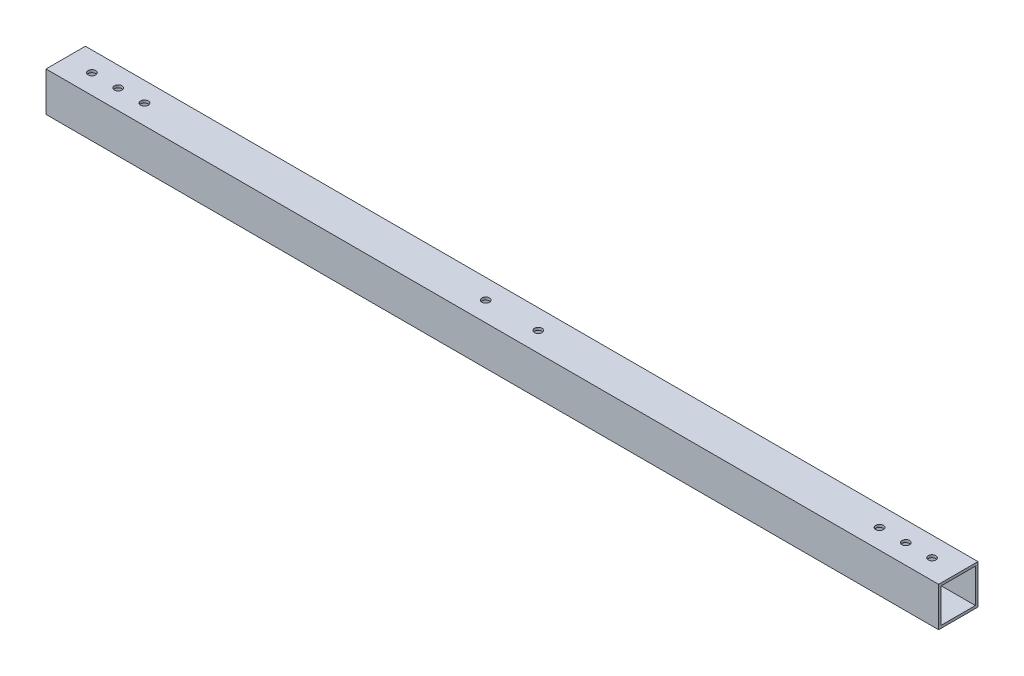
ISO-10303-21;
HEADER;
FILE_DESCRIPTION(('STEP AP214'),'2;1');
FILE_NAME('part.step','',(''),(''),'','','');
FILE_SCHEMA(('AUTOMOTIVE_DESIGN { 1 0 10303 214 1 1 1 1 }'));
ENDSEC;
DATA;
#1=APPLICATION_CONTEXT('core data for automotive mechanical design processes');
#2=APPLICATION_PROTOCOL_DEFINITION('international standard','automotive_design',2000,#1);
#3=PRODUCT_CONTEXT('',#1,'mechanical');
#4=PRODUCT('Part','Part','',(#3));
#5=PRODUCT_RELATED_PRODUCT_CATEGORY('part','',(#4));
#6=PRODUCT_DEFINITION_FORMATION('','',#4);
#7=PRODUCT_DEFINITION_CONTEXT('part definition',#1,'design');
#8=PRODUCT_DEFINITION('design','',#6,#7);
#9=PRODUCT_DEFINITION_SHAPE('','',#8);
#10=(LENGTH_UNIT() NAMED_UNIT(*) SI_UNIT(.MILLI.,.METRE.));
#11=(NAMED_UNIT(*) PLANE_ANGLE_UNIT() SI_UNIT($,.RADIAN.));
#12=(NAMED_UNIT(*) SI_UNIT($,.STERADIAN.) SOLID_ANGLE_UNIT());
#13=UNCERTAINTY_MEASURE_WITH_UNIT(LENGTH_MEASURE(1.E-05),#10,'distance_accuracy_value','');
#14=(GEOMETRIC_REPRESENTATION_CONTEXT(3) GLOBAL_UNCERTAINTY_ASSIGNED_CONTEXT((#13)) GLOBAL_UNIT_ASSIGNED_CONTEXT((#10,
#11,#12)) REPRESENTATION_CONTEXT('',''));
#15=CARTESIAN_POINT('',(0.,0.,0.));
#16=DIRECTION('',(0.,0.,1.));
#17=DIRECTION('',(1.,0.,0.));
#18=AXIS2_PLACEMENT_3D('',#15,#16,#17);
#19=CARTESIAN_POINT('',(340.,0.,0.));
#20=DIRECTION('',(1.,0.,0.));
#21=DIRECTION('',(0.,0.,-1.));
#22=AXIS2_PLACEMENT_3D('',#19,#20,#21);
#23=PLANE('',#22);
#24=DIRECTION('',(0.,1.,0.));
#25=VECTOR('',#24,1.);
#26=CARTESIAN_POINT('',(340.,7.5,-7.5));
#27=LINE('',#26,#25);
#28=CARTESIAN_POINT('',(340.,-7.5,-7.5));
#29=VERTEX_POINT('',#28);
#30=CARTESIAN_POINT('',(340.,7.5,-7.5));
#31=VERTEX_POINT('',#30);
#32=EDGE_CURVE('E146',#29,#31,#27,.T.);
#33=ORIENTED_EDGE('',*,*,#32,.T.);
#34=DIRECTION('',(0.,0.,1.));
#35=VECTOR('',#34,1.);
#36=CARTESIAN_POINT('',(340.,7.5,7.50000000000001));
#37=LINE('',#36,#35);
#38=CARTESIAN_POINT('',(340.,7.5,7.50000000000001));
#39=VERTEX_POINT('',#38);
#40=EDGE_CURVE('E149',#31,#39,#37,.T.);
#41=ORIENTED_EDGE('',*,*,#40,.T.);
#42=DIRECTION('',(0.,-1.,0.));
#43=VECTOR('',#42,1.);
#44=CARTESIAN_POINT('',(340.,7.5,7.50000000000001));
#45=LINE('',#44,#43);
#46=CARTESIAN_POINT('',(340.,-7.5,7.5));
#47=VERTEX_POINT('',#46);
#48=EDGE_CURVE('E152',#39,#47,#45,.T.);
#49=ORIENTED_EDGE('',*,*,#48,.T.);
#50=DIRECTION('',(0.,0.,-1.));
#51=VECTOR('',#50,1.);
#52=CARTESIAN_POINT('',(340.,-7.5,7.5));
#53=LINE('',#52,#51);
#54=EDGE_CURVE('E154',#47,#29,#53,.T.);
#55=ORIENTED_EDGE('',*,*,#54,.T.);
#56=EDGE_LOOP('',(#33,#41,#49,#55));
#57=FACE_BOUND('',#56,.T.);
#58=DIRECTION('',(0.,0.,1.));
#59=VECTOR('',#58,1.);
#60=CARTESIAN_POINT('',(340.,6.5,6.5));
#61=LINE('',#60,#59);
#62=CARTESIAN_POINT('',(340.,6.5,-6.5));
#63=VERTEX_POINT('',#62);
#64=CARTESIAN_POINT('',(340.,6.5,6.5));
#65=VERTEX_POINT('',#64);
#66=EDGE_CURVE('E116',#63,#65,#61,.T.);
#67=ORIENTED_EDGE('',*,*,#66,.F.);
#68=DIRECTION('',(0.,1.,0.));
#69=VECTOR('',#68,1.);
#70=CARTESIAN_POINT('',(340.,6.5,-6.5));
#71=LINE('',#70,#69);
#72=CARTESIAN_POINT('',(340.,-6.5,-6.5));
#73=VERTEX_POINT('',#72);
#74=EDGE_CURVE('E108',#73,#63,#71,.T.);
#75=ORIENTED_EDGE('',*,*,#74,.F.);
#76=DIRECTION('',(0.,0.,-1.));
#77=VECTOR('',#76,1.);
#78=CARTESIAN_POINT('',(340.,-6.5,6.5));
#79=LINE('',#78,#77);
#80=CARTESIAN_POINT('',(340.,-6.5,6.5));
#81=VERTEX_POINT('',#80);
#82=EDGE_CURVE('E130',#81,#73,#79,.T.);
#83=ORIENTED_EDGE('',*,*,#82,.F.);
#84=DIRECTION('',(0.,-1.,0.));
#85=VECTOR('',#84,1.);
#86=CARTESIAN_POINT('',(340.,6.5,6.5));
#87=LINE('',#86,#85);
#88=EDGE_CURVE('E128',#65,#81,#87,.T.);
#89=ORIENTED_EDGE('',*,*,#88,.F.);
#90=EDGE_LOOP('',(#67,#75,#83,#89));
#91=FACE_BOUND('',#90,.T.);
#92=ADVANCED_FACE('F41',(#57,#91),#23,.T.);
#93=CARTESIAN_POINT('',(0.,0.,0.));
#94=DIRECTION('',(1.,0.,0.));
#95=DIRECTION('',(0.,0.,-1.));
#96=AXIS2_PLACEMENT_3D('',#93,#94,#95);
#97=PLANE('',#96);
#98=DIRECTION('',(0.,1.,0.));
#99=VECTOR('',#98,1.);
#100=CARTESIAN_POINT('',(0.,7.5,-7.5));
#101=LINE('',#100,#99);
#102=CARTESIAN_POINT('',(0.,-7.5,-7.5));
#103=VERTEX_POINT('',#102);
#104=CARTESIAN_POINT('',(0.,7.5,-7.5));
#105=VERTEX_POINT('',#104);
#106=EDGE_CURVE('E124',#103,#105,#101,.T.);
#107=ORIENTED_EDGE('',*,*,#106,.F.);
#108=DIRECTION('',(0.,0.,-1.));
#109=VECTOR('',#108,1.);
#110=CARTESIAN_POINT('',(0.,-7.5,7.5));
#111=LINE('',#110,#109);
#112=CARTESIAN_POINT('',(0.,-7.5,7.5));
#113=VERTEX_POINT('',#112);
#114=EDGE_CURVE('E150',#113,#103,#111,.T.);
#115=ORIENTED_EDGE('',*,*,#114,.F.);
#116=DIRECTION('',(0.,-1.,0.));
#117=VECTOR('',#116,1.);
#118=CARTESIAN_POINT('',(0.,7.5,7.50000000000001));
#119=LINE('',#118,#117);
#120=CARTESIAN_POINT('',(0.,7.5,7.50000000000001));
#121=VERTEX_POINT('',#120);
#122=EDGE_CURVE('E161',#121,#113,#119,.T.);
#123=ORIENTED_EDGE('',*,*,#122,.F.);
#124=DIRECTION('',(0.,0.,1.));
#125=VECTOR('',#124,1.);
#126=CARTESIAN_POINT('',(0.,7.5,7.50000000000001));
#127=LINE('',#126,#125);
#128=EDGE_CURVE('E159',#105,#121,#127,.T.);
#129=ORIENTED_EDGE('',*,*,#128,.F.);
#130=EDGE_LOOP('',(#107,#115,#123,#129));
#131=FACE_BOUND('',#130,.T.);
#132=DIRECTION('',(0.,1.,0.));
#133=VECTOR('',#132,1.);
#134=CARTESIAN_POINT('',(0.,6.5,-6.5));
#135=LINE('',#134,#133);
#136=CARTESIAN_POINT('',(0.,-6.5,-6.5));
#137=VERTEX_POINT('',#136);
#138=CARTESIAN_POINT('',(0.,6.5,-6.5));
#139=VERTEX_POINT('',#138);
#140=EDGE_CURVE('E66',#137,#139,#135,.T.);
#141=ORIENTED_EDGE('',*,*,#140,.T.);
#142=DIRECTION('',(0.,0.,1.));
#143=VECTOR('',#142,1.);
#144=CARTESIAN_POINT('',(0.,6.5,6.5));
#145=LINE('',#144,#143);
#146=CARTESIAN_POINT('',(0.,6.5,6.5));
#147=VERTEX_POINT('',#146);
#148=EDGE_CURVE('E123',#139,#147,#145,.T.);
#149=ORIENTED_EDGE('',*,*,#148,.T.);
#150=DIRECTION('',(0.,-1.,0.));
#151=VECTOR('',#150,1.);
#152=CARTESIAN_POINT('',(0.,6.5,6.5));
#153=LINE('',#152,#151);
#154=CARTESIAN_POINT('',(0.,-6.5,6.5));
#155=VERTEX_POINT('',#154);
#156=EDGE_CURVE('E138',#147,#155,#153,.T.);
#157=ORIENTED_EDGE('',*,*,#156,.T.);
#158=DIRECTION('',(0.,0.,-1.));
#159=VECTOR('',#158,1.);
#160=CARTESIAN_POINT('',(0.,-6.5,6.5));
#161=LINE('',#160,#159);
#162=EDGE_CURVE('E117',#155,#137,#161,.T.);
#163=ORIENTED_EDGE('',*,*,#162,.T.);
#164=EDGE_LOOP('',(#141,#149,#157,#163));
#165=FACE_BOUND('',#164,.T.);
#166=ADVANCED_FACE('F259',(#131,#165),#97,.F.);
#167=CARTESIAN_POINT('',(340.,7.5,-7.5));
#168=DIRECTION('',(0.,0.,1.));
#169=DIRECTION('',(0.,-1.,0.));
#170=AXIS2_PLACEMENT_3D('',#167,#168,#169);
#171=PLANE('',#170);
#172=ORIENTED_EDGE('',*,*,#106,.T.);
#173=DIRECTION('',(-1.,0.,0.));
#174=VECTOR('',#173,1.);
#175=CARTESIAN_POINT('',(340.,7.5,-7.5));
#176=LINE('',#175,#174);
#177=EDGE_CURVE('E11',#31,#105,#176,.T.);
#178=ORIENTED_EDGE('',*,*,#177,.F.);
#179=ORIENTED_EDGE('',*,*,#32,.F.);
#180=DIRECTION('',(-1.,0.,0.));
#181=VECTOR('',#180,1.);
#182=CARTESIAN_POINT('',(340.,-7.5,-7.5));
#183=LINE('',#182,#181);
#184=EDGE_CURVE('E156',#29,#103,#183,.T.);
#185=ORIENTED_EDGE('',*,*,#184,.T.);
#186=EDGE_LOOP('',(#172,#178,#179,#185));
#187=FACE_BOUND('',#186,.T.);
#188=ADVANCED_FACE('F43',(#187),#171,.F.);
#189=CARTESIAN_POINT('',(340.,7.5,7.50000000000001));
#190=DIRECTION('',(0.,-1.,0.));
#191=DIRECTION('',(0.,0.,-1.));
#192=AXIS2_PLACEMENT_3D('',#189,#190,#191);
#193=PLANE('',#192);
#194=CARTESIAN_POINT('',(9.99999999999965,7.5,0.));
#195=DIRECTION('',(0.,1.,0.));
#196=DIRECTION('',(0.,0.,1.));
#197=AXIS2_PLACEMENT_3D('',#194,#195,#196);
#198=CIRCLE('',#197,1.45);
#199=CARTESIAN_POINT('',(9.99999999999965,7.5,1.44999999999995));
#200=VERTEX_POINT('',#199);
#201=EDGE_CURVE('E493',#200,#200,#198,.T.);
#202=ORIENTED_EDGE('',*,*,#201,.F.);
#203=EDGE_LOOP('',(#202));
#204=FACE_BOUND('',#203,.T.);
#205=CARTESIAN_POINT('',(320.,7.5,0.));
#206=DIRECTION('',(0.,1.,0.));
#207=DIRECTION('',(0.,0.,-1.));
#208=AXIS2_PLACEMENT_3D('',#205,#206,#207);
#209=CIRCLE('',#208,1.45);
#210=CARTESIAN_POINT('',(320.,7.5,-1.45000000000005));
#211=VERTEX_POINT('',#210);
#212=EDGE_CURVE('E502',#211,#211,#209,.T.);
#213=ORIENTED_EDGE('',*,*,#212,.F.);
#214=EDGE_LOOP('',(#213));
#215=FACE_BOUND('',#214,.T.);
#216=CARTESIAN_POINT('',(310.,7.5,0.));
#217=DIRECTION('',(0.,1.,0.));
#218=DIRECTION('',(0.,0.,1.));
#219=AXIS2_PLACEMENT_3D('',#216,#217,#218);
#220=CIRCLE('',#219,1.45);
#221=CARTESIAN_POINT('',(310.,7.5,1.44999999999995));
#222=VERTEX_POINT('',#221);
#223=EDGE_CURVE('E512',#222,#222,#220,.T.);
#224=ORIENTED_EDGE('',*,*,#223,.F.);
#225=EDGE_LOOP('',(#224));
#226=FACE_BOUND('',#225,.T.);
#227=CARTESIAN_POINT('',(330.,7.5,0.));
#228=DIRECTION('',(0.,1.,0.));
#229=DIRECTION('',(0.,0.,-1.));
#230=AXIS2_PLACEMENT_3D('',#227,#228,#229);
#231=CIRCLE('',#230,1.44999999999995);
#232=CARTESIAN_POINT('',(330.,7.5,-1.44999999999999));
#233=VERTEX_POINT('',#232);
#234=EDGE_CURVE('E494',#233,#233,#231,.T.);
#235=ORIENTED_EDGE('',*,*,#234,.F.);
#236=EDGE_LOOP('',(#235));
#237=FACE_BOUND('',#236,.T.);
#238=CARTESIAN_POINT('',(29.9999999999997,7.5,0.));
#239=DIRECTION('',(0.,1.,0.));
#240=DIRECTION('',(0.,0.,-1.));
#241=AXIS2_PLACEMENT_3D('',#238,#239,#240);
#242=CIRCLE('',#241,1.45);
#243=CARTESIAN_POINT('',(29.9999999999997,7.5,-1.45000000000005));
#244=VERTEX_POINT('',#243);
#245=EDGE_CURVE('E517',#244,#244,#242,.T.);
#246=ORIENTED_EDGE('',*,*,#245,.F.);
#247=EDGE_LOOP('',(#246));
#248=FACE_BOUND('',#247,.T.);
#249=CARTESIAN_POINT('',(19.9999999999996,7.5,0.));
#250=DIRECTION('',(0.,1.,0.));
#251=DIRECTION('',(0.,0.,1.));
#252=AXIS2_PLACEMENT_3D('',#249,#250,#251);
#253=CIRCLE('',#252,1.45);
#254=CARTESIAN_POINT('',(19.9999999999996,7.5,1.44999999999995));
#255=VERTEX_POINT('',#254);
#256=EDGE_CURVE('E508',#255,#255,#253,.T.);
#257=ORIENTED_EDGE('',*,*,#256,.F.);
#258=EDGE_LOOP('',(#257));
#259=FACE_BOUND('',#258,.T.);
#260=CARTESIAN_POINT('',(160.,7.5,0.));
#261=DIRECTION('',(0.,-1.,0.));
#262=DIRECTION('',(0.,0.,-1.));
#263=AXIS2_PLACEMENT_3D('',#260,#261,#262);
#264=CIRCLE('',#263,1.45);
#265=CARTESIAN_POINT('',(160.,7.5,-1.45));
#266=VERTEX_POINT('',#265);
#267=EDGE_CURVE('E175',#266,#266,#264,.T.);
#268=ORIENTED_EDGE('',*,*,#267,.T.);
#269=EDGE_LOOP('',(#268));
#270=FACE_BOUND('',#269,.T.);
#271=CARTESIAN_POINT('',(180.,7.5,0.));
#272=DIRECTION('',(0.,-1.,0.));
#273=DIRECTION('',(0.,0.,1.));
#274=AXIS2_PLACEMENT_3D('',#271,#272,#273);
#275=CIRCLE('',#274,1.45);
#276=CARTESIAN_POINT('',(180.,7.5,1.45));
#277=VERTEX_POINT('',#276);
#278=EDGE_CURVE('E212',#277,#277,#275,.T.);
#279=ORIENTED_EDGE('',*,*,#278,.T.);
#280=EDGE_LOOP('',(#279));
#281=FACE_BOUND('',#280,.T.);
#282=ORIENTED_EDGE('',*,*,#128,.T.);
#283=DIRECTION('',(-1.,0.,0.));
#284=VECTOR('',#283,1.);
#285=CARTESIAN_POINT('',(340.,7.5,7.50000000000001));
#286=LINE('',#285,#284);
#287=EDGE_CURVE('E50',#39,#121,#286,.T.);
#288=ORIENTED_EDGE('',*,*,#287,.F.);
#289=ORIENTED_EDGE('',*,*,#40,.F.);
#290=ORIENTED_EDGE('',*,*,#177,.T.);
#291=EDGE_LOOP('',(#282,#288,#289,#290));
#292=FACE_BOUND('',#291,.T.);
#293=ADVANCED_FACE('F245',(#204,#215,#226,#237,#248,#259,#270,#281,#292),#193,.F.);
#294=CARTESIAN_POINT('',(340.,7.5,7.50000000000001));
#295=DIRECTION('',(0.,0.,-1.));
#296=DIRECTION('',(0.,1.,0.));
#297=AXIS2_PLACEMENT_3D('',#294,#295,#296);
#298=PLANE('',#297);
#299=ORIENTED_EDGE('',*,*,#122,.T.);
#300=DIRECTION('',(-1.,0.,0.));
#301=VECTOR('',#300,1.);
#302=CARTESIAN_POINT('',(340.,-7.5,7.5));
#303=LINE('',#302,#301);
#304=EDGE_CURVE('E166',#47,#113,#303,.T.);
#305=ORIENTED_EDGE('',*,*,#304,.F.);
#306=ORIENTED_EDGE('',*,*,#48,.F.);
#307=ORIENTED_EDGE('',*,*,#287,.T.);
#308=EDGE_LOOP('',(#299,#305,#306,#307));
#309=FACE_BOUND('',#308,.T.);
#310=ADVANCED_FACE('F248',(#309),#298,.F.);
#311=CARTESIAN_POINT('',(340.,-7.5,7.5));
#312=DIRECTION('',(0.,1.,0.));
#313=DIRECTION('',(0.,0.,1.));
#314=AXIS2_PLACEMENT_3D('',#311,#312,#313);
#315=PLANE('',#314);
#316=CARTESIAN_POINT('',(9.99999999999965,-7.5,0.));
#317=DIRECTION('',(0.,1.,0.));
#318=DIRECTION('',(0.,0.,1.));
#319=AXIS2_PLACEMENT_3D('',#316,#317,#318);
#320=CIRCLE('',#319,1.45);
#321=CARTESIAN_POINT('',(9.99999999999965,-7.5,1.44999999999995));
#322=VERTEX_POINT('',#321);
#323=EDGE_CURVE('E183',#322,#322,#320,.T.);
#324=ORIENTED_EDGE('',*,*,#323,.T.);
#325=EDGE_LOOP('',(#324));
#326=FACE_BOUND('',#325,.T.);
#327=CARTESIAN_POINT('',(320.,-7.5,0.));
#328=DIRECTION('',(0.,1.,0.));
#329=DIRECTION('',(0.,0.,-1.));
#330=AXIS2_PLACEMENT_3D('',#327,#328,#329);
#331=CIRCLE('',#330,1.45);
#332=CARTESIAN_POINT('',(320.,-7.5,-1.45000000000005));
#333=VERTEX_POINT('',#332);
#334=EDGE_CURVE('E506',#333,#333,#331,.T.);
#335=ORIENTED_EDGE('',*,*,#334,.T.);
#336=EDGE_LOOP('',(#335));
#337=FACE_BOUND('',#336,.T.);
#338=CARTESIAN_POINT('',(310.,-7.5,0.));
#339=DIRECTION('',(0.,1.,0.));
#340=DIRECTION('',(0.,0.,1.));
#341=AXIS2_PLACEMENT_3D('',#338,#339,#340);
#342=CIRCLE('',#341,1.45);
#343=CARTESIAN_POINT('',(310.,-7.5,1.44999999999995));
#344=VERTEX_POINT('',#343);
#345=EDGE_CURVE('E505',#344,#344,#342,.T.);
#346=ORIENTED_EDGE('',*,*,#345,.T.);
#347=EDGE_LOOP('',(#346));
#348=FACE_BOUND('',#347,.T.);
#349=CARTESIAN_POINT('',(330.,-7.5,0.));
#350=DIRECTION('',(0.,1.,0.));
#351=DIRECTION('',(0.,0.,-1.));
#352=AXIS2_PLACEMENT_3D('',#349,#350,#351);
#353=CIRCLE('',#352,1.44999999999995);
#354=CARTESIAN_POINT('',(330.,-7.5,-1.44999999999999));
#355=VERTEX_POINT('',#354);
#356=EDGE_CURVE('E499',#355,#355,#353,.T.);
#357=ORIENTED_EDGE('',*,*,#356,.T.);
#358=EDGE_LOOP('',(#357));
#359=FACE_BOUND('',#358,.T.);
#360=CARTESIAN_POINT('',(29.9999999999997,-7.5,0.));
#361=DIRECTION('',(0.,1.,0.));
#362=DIRECTION('',(0.,0.,-1.));
#363=AXIS2_PLACEMENT_3D('',#360,#361,#362);
#364=CIRCLE('',#363,1.45);
#365=CARTESIAN_POINT('',(29.9999999999997,-7.5,-1.45000000000005));
#366=VERTEX_POINT('',#365);
#367=EDGE_CURVE('E521',#366,#366,#364,.T.);
#368=ORIENTED_EDGE('',*,*,#367,.T.);
#369=EDGE_LOOP('',(#368));
#370=FACE_BOUND('',#369,.T.);
#371=CARTESIAN_POINT('',(19.9999999999996,-7.5,0.));
#372=DIRECTION('',(0.,1.,0.));
#373=DIRECTION('',(0.,0.,1.));
#374=AXIS2_PLACEMENT_3D('',#371,#372,#373);
#375=CIRCLE('',#374,1.45);
#376=CARTESIAN_POINT('',(19.9999999999996,-7.5,1.44999999999995));
#377=VERTEX_POINT('',#376);
#378=EDGE_CURVE('E520',#377,#377,#375,.T.);
#379=ORIENTED_EDGE('',*,*,#378,.T.);
#380=EDGE_LOOP('',(#379));
#381=FACE_BOUND('',#380,.T.);
#382=CARTESIAN_POINT('',(160.,-7.5,0.));
#383=DIRECTION('',(0.,-1.,0.));
#384=DIRECTION('',(0.,0.,-1.));
#385=AXIS2_PLACEMENT_3D('',#382,#383,#384);
#386=CIRCLE('',#385,1.45);
#387=CARTESIAN_POINT('',(160.,-7.5,-1.45));
#388=VERTEX_POINT('',#387);
#389=EDGE_CURVE('E215',#388,#388,#386,.T.);
#390=ORIENTED_EDGE('',*,*,#389,.F.);
#391=EDGE_LOOP('',(#390));
#392=FACE_BOUND('',#391,.T.);
#393=CARTESIAN_POINT('',(180.,-7.5,0.));
#394=DIRECTION('',(0.,-1.,0.));
#395=DIRECTION('',(0.,0.,1.));
#396=AXIS2_PLACEMENT_3D('',#393,#394,#395);
#397=CIRCLE('',#396,1.45);
#398=CARTESIAN_POINT('',(180.,-7.5,1.45));
#399=VERTEX_POINT('',#398);
#400=EDGE_CURVE('E218',#399,#399,#397,.T.);
#401=ORIENTED_EDGE('',*,*,#400,.F.);
#402=EDGE_LOOP('',(#401));
#403=FACE_BOUND('',#402,.T.);
#404=ORIENTED_EDGE('',*,*,#114,.T.);
#405=ORIENTED_EDGE('',*,*,#184,.F.);
#406=ORIENTED_EDGE('',*,*,#54,.F.);
#407=ORIENTED_EDGE('',*,*,#304,.T.);
#408=EDGE_LOOP('',(#404,#405,#406,#407));
#409=FACE_BOUND('',#408,.T.);
#410=ADVANCED_FACE('F263',(#326,#337,#348,#359,#370,#381,#392,#403,#409),#315,.F.);
#411=CARTESIAN_POINT('',(340.,6.5,-6.5));
#412=DIRECTION('',(0.,0.,1.));
#413=DIRECTION('',(0.,-1.,0.));
#414=AXIS2_PLACEMENT_3D('',#411,#412,#413);
#415=PLANE('',#414);
#416=ORIENTED_EDGE('',*,*,#140,.F.);
#417=DIRECTION('',(-1.,0.,0.));
#418=VECTOR('',#417,1.);
#419=CARTESIAN_POINT('',(340.,-6.5,-6.5));
#420=LINE('',#419,#418);
#421=EDGE_CURVE('E112',#73,#137,#420,.T.);
#422=ORIENTED_EDGE('',*,*,#421,.F.);
#423=ORIENTED_EDGE('',*,*,#74,.T.);
#424=DIRECTION('',(-1.,0.,0.));
#425=VECTOR('',#424,1.);
#426=CARTESIAN_POINT('',(340.,6.5,-6.5));
#427=LINE('',#426,#425);
#428=EDGE_CURVE('E111',#63,#139,#427,.T.);
#429=ORIENTED_EDGE('',*,*,#428,.T.);
#430=EDGE_LOOP('',(#416,#422,#423,#429));
#431=FACE_BOUND('',#430,.T.);
#432=ADVANCED_FACE('F110',(#431),#415,.T.);
#433=CARTESIAN_POINT('',(340.,6.5,6.5));
#434=DIRECTION('',(0.,-1.,0.));
#435=DIRECTION('',(0.,0.,-1.));
#436=AXIS2_PLACEMENT_3D('',#433,#434,#435);
#437=PLANE('',#436);
#438=CARTESIAN_POINT('',(9.99999999999965,6.5,0.));
#439=DIRECTION('',(0.,-1.,0.));
#440=DIRECTION('',(0.,0.,-1.));
#441=AXIS2_PLACEMENT_3D('',#438,#439,#440);
#442=CIRCLE('',#441,1.45);
#443=CARTESIAN_POINT('',(9.99999999999965,6.5,-1.45000000000005));
#444=VERTEX_POINT('',#443);
#445=EDGE_CURVE('E209',#444,#444,#442,.T.);
#446=ORIENTED_EDGE('',*,*,#445,.F.);
#447=EDGE_LOOP('',(#446));
#448=FACE_BOUND('',#447,.T.);
#449=CARTESIAN_POINT('',(320.,6.5,0.));
#450=DIRECTION('',(0.,-1.,0.));
#451=DIRECTION('',(0.,0.,-1.));
#452=AXIS2_PLACEMENT_3D('',#449,#450,#451);
#453=CIRCLE('',#452,1.45);
#454=CARTESIAN_POINT('',(320.,6.5,-1.45000000000005));
#455=VERTEX_POINT('',#454);
#456=EDGE_CURVE('E197',#455,#455,#453,.T.);
#457=ORIENTED_EDGE('',*,*,#456,.F.);
#458=EDGE_LOOP('',(#457));
#459=FACE_BOUND('',#458,.T.);
#460=CARTESIAN_POINT('',(310.,6.5,0.));
#461=DIRECTION('',(0.,-1.,0.));
#462=DIRECTION('',(0.,0.,-1.));
#463=AXIS2_PLACEMENT_3D('',#460,#461,#462);
#464=CIRCLE('',#463,1.45);
#465=CARTESIAN_POINT('',(310.,6.5,-1.45000000000005));
#466=VERTEX_POINT('',#465);
#467=EDGE_CURVE('E194',#466,#466,#464,.T.);
#468=ORIENTED_EDGE('',*,*,#467,.F.);
#469=EDGE_LOOP('',(#468));
#470=FACE_BOUND('',#469,.T.);
#471=CARTESIAN_POINT('',(330.,6.5,0.));
#472=DIRECTION('',(0.,-1.,0.));
#473=DIRECTION('',(0.,0.,-1.));
#474=AXIS2_PLACEMENT_3D('',#471,#472,#473);
#475=CIRCLE('',#474,1.44999999999995);
#476=CARTESIAN_POINT('',(330.,6.5,-1.44999999999999));
#477=VERTEX_POINT('',#476);
#478=EDGE_CURVE('E191',#477,#477,#475,.T.);
#479=ORIENTED_EDGE('',*,*,#478,.F.);
#480=EDGE_LOOP('',(#479));
#481=FACE_BOUND('',#480,.T.);
#482=CARTESIAN_POINT('',(29.9999999999997,6.5,0.));
#483=DIRECTION('',(0.,-1.,0.));
#484=DIRECTION('',(0.,0.,-1.));
#485=AXIS2_PLACEMENT_3D('',#482,#483,#484);
#486=CIRCLE('',#485,1.45);
#487=CARTESIAN_POINT('',(29.9999999999997,6.5,-1.45000000000005));
#488=VERTEX_POINT('',#487);
#489=EDGE_CURVE('E187',#488,#488,#486,.T.);
#490=ORIENTED_EDGE('',*,*,#489,.F.);
#491=EDGE_LOOP('',(#490));
#492=FACE_BOUND('',#491,.T.);
#493=CARTESIAN_POINT('',(19.9999999999996,6.5,0.));
#494=DIRECTION('',(0.,-1.,0.));
#495=DIRECTION('',(0.,0.,-1.));
#496=AXIS2_PLACEMENT_3D('',#493,#494,#495);
#497=CIRCLE('',#496,1.45);
#498=CARTESIAN_POINT('',(19.9999999999996,6.5,-1.45000000000005));
#499=VERTEX_POINT('',#498);
#500=EDGE_CURVE('E182',#499,#499,#497,.T.);
#501=ORIENTED_EDGE('',*,*,#500,.F.);
#502=EDGE_LOOP('',(#501));
#503=FACE_BOUND('',#502,.T.);
#504=CARTESIAN_POINT('',(160.,6.5,0.));
#505=DIRECTION('',(0.,-1.,0.));
#506=DIRECTION('',(0.,0.,-1.));
#507=AXIS2_PLACEMENT_3D('',#504,#505,#506);
#508=CIRCLE('',#507,1.45);
#509=CARTESIAN_POINT('',(160.,6.5,-1.45));
#510=VERTEX_POINT('',#509);
#511=EDGE_CURVE('E136',#510,#510,#508,.T.);
#512=ORIENTED_EDGE('',*,*,#511,.F.);
#513=EDGE_LOOP('',(#512));
#514=FACE_BOUND('',#513,.T.);
#515=CARTESIAN_POINT('',(180.,6.5,0.));
#516=DIRECTION('',(0.,-1.,0.));
#517=DIRECTION('',(0.,0.,-1.));
#518=AXIS2_PLACEMENT_3D('',#515,#516,#517);
#519=CIRCLE('',#518,1.45);
#520=CARTESIAN_POINT('',(180.,6.5,-1.45));
#521=VERTEX_POINT('',#520);
#522=EDGE_CURVE('E174',#521,#521,#519,.T.);
#523=ORIENTED_EDGE('',*,*,#522,.F.);
#524=EDGE_LOOP('',(#523));
#525=FACE_BOUND('',#524,.T.);
#526=ORIENTED_EDGE('',*,*,#148,.F.);
#527=ORIENTED_EDGE('',*,*,#428,.F.);
#528=ORIENTED_EDGE('',*,*,#66,.T.);
#529=DIRECTION('',(-1.,0.,0.));
#530=VECTOR('',#529,1.);
#531=CARTESIAN_POINT('',(340.,6.5,6.5));
#532=LINE('',#531,#530);
#533=EDGE_CURVE('E125',#65,#147,#532,.T.);
#534=ORIENTED_EDGE('',*,*,#533,.T.);
#535=EDGE_LOOP('',(#526,#527,#528,#534));
#536=FACE_BOUND('',#535,.T.);
#537=ADVANCED_FACE('F120',(#448,#459,#470,#481,#492,#503,#514,#525,#536),#437,.T.);
#538=CARTESIAN_POINT('',(340.,6.5,6.5));
#539=DIRECTION('',(0.,0.,-1.));
#540=DIRECTION('',(0.,1.,0.));
#541=AXIS2_PLACEMENT_3D('',#538,#539,#540);
#542=PLANE('',#541);
#543=ORIENTED_EDGE('',*,*,#156,.F.);
#544=ORIENTED_EDGE('',*,*,#533,.F.);
#545=ORIENTED_EDGE('',*,*,#88,.T.);
#546=DIRECTION('',(-1.,0.,0.));
#547=VECTOR('',#546,1.);
#548=CARTESIAN_POINT('',(340.,-6.5,6.5));
#549=LINE('',#548,#547);
#550=EDGE_CURVE('E58',#81,#155,#549,.T.);
#551=ORIENTED_EDGE('',*,*,#550,.T.);
#552=EDGE_LOOP('',(#543,#544,#545,#551));
#553=FACE_BOUND('',#552,.T.);
#554=ADVANCED_FACE('F232',(#553),#542,.T.);
#555=CARTESIAN_POINT('',(340.,-6.5,6.5));
#556=DIRECTION('',(0.,1.,0.));
#557=DIRECTION('',(0.,0.,1.));
#558=AXIS2_PLACEMENT_3D('',#555,#556,#557);
#559=PLANE('',#558);
#560=CARTESIAN_POINT('',(9.99999999999965,-6.5,0.));
#561=DIRECTION('',(0.,1.,0.));
#562=DIRECTION('',(0.,0.,1.));
#563=AXIS2_PLACEMENT_3D('',#560,#561,#562);
#564=CIRCLE('',#563,1.45);
#565=CARTESIAN_POINT('',(9.99999999999965,-6.5,1.44999999999995));
#566=VERTEX_POINT('',#565);
#567=EDGE_CURVE('E45',#566,#566,#564,.T.);
#568=ORIENTED_EDGE('',*,*,#567,.F.);
#569=EDGE_LOOP('',(#568));
#570=FACE_BOUND('',#569,.T.);
#571=CARTESIAN_POINT('',(320.,-6.5,0.));
#572=DIRECTION('',(0.,1.,0.));
#573=DIRECTION('',(0.,0.,1.));
#574=AXIS2_PLACEMENT_3D('',#571,#572,#573);
#575=CIRCLE('',#574,1.45);
#576=CARTESIAN_POINT('',(320.,-6.5,1.44999999999995));
#577=VERTEX_POINT('',#576);
#578=EDGE_CURVE('E195',#577,#577,#575,.T.);
#579=ORIENTED_EDGE('',*,*,#578,.F.);
#580=EDGE_LOOP('',(#579));
#581=FACE_BOUND('',#580,.T.);
#582=CARTESIAN_POINT('',(310.,-6.5,0.));
#583=DIRECTION('',(0.,1.,0.));
#584=DIRECTION('',(0.,0.,1.));
#585=AXIS2_PLACEMENT_3D('',#582,#583,#584);
#586=CIRCLE('',#585,1.45);
#587=CARTESIAN_POINT('',(310.,-6.5,1.44999999999995));
#588=VERTEX_POINT('',#587);
#589=EDGE_CURVE('E192',#588,#588,#586,.T.);
#590=ORIENTED_EDGE('',*,*,#589,.F.);
#591=EDGE_LOOP('',(#590));
#592=FACE_BOUND('',#591,.T.);
#593=CARTESIAN_POINT('',(330.,-6.5,0.));
#594=DIRECTION('',(0.,1.,0.));
#595=DIRECTION('',(0.,0.,1.));
#596=AXIS2_PLACEMENT_3D('',#593,#594,#595);
#597=CIRCLE('',#596,1.44999999999995);
#598=CARTESIAN_POINT('',(330.,-6.5,1.4499999999999));
#599=VERTEX_POINT('',#598);
#600=EDGE_CURVE('E188',#599,#599,#597,.T.);
#601=ORIENTED_EDGE('',*,*,#600,.F.);
#602=EDGE_LOOP('',(#601));
#603=FACE_BOUND('',#602,.T.);
#604=CARTESIAN_POINT('',(29.9999999999997,-6.5,0.));
#605=DIRECTION('',(0.,1.,0.));
#606=DIRECTION('',(0.,0.,1.));
#607=AXIS2_PLACEMENT_3D('',#604,#605,#606);
#608=CIRCLE('',#607,1.45);
#609=CARTESIAN_POINT('',(29.9999999999997,-6.5,1.44999999999995));
#610=VERTEX_POINT('',#609);
#611=EDGE_CURVE('E184',#610,#610,#608,.T.);
#612=ORIENTED_EDGE('',*,*,#611,.F.);
#613=EDGE_LOOP('',(#612));
#614=FACE_BOUND('',#613,.T.);
#615=CARTESIAN_POINT('',(19.9999999999996,-6.5,0.));
#616=DIRECTION('',(0.,1.,0.));
#617=DIRECTION('',(0.,0.,1.));
#618=AXIS2_PLACEMENT_3D('',#615,#616,#617);
#619=CIRCLE('',#618,1.45);
#620=CARTESIAN_POINT('',(19.9999999999996,-6.5,1.44999999999995));
#621=VERTEX_POINT('',#620);
#622=EDGE_CURVE('E179',#621,#621,#619,.T.);
#623=ORIENTED_EDGE('',*,*,#622,.F.);
#624=EDGE_LOOP('',(#623));
#625=FACE_BOUND('',#624,.T.);
#626=CARTESIAN_POINT('',(160.,-6.5,0.));
#627=DIRECTION('',(0.,1.,0.));
#628=DIRECTION('',(0.,0.,1.));
#629=AXIS2_PLACEMENT_3D('',#626,#627,#628);
#630=CIRCLE('',#629,1.45);
#631=CARTESIAN_POINT('',(160.,-6.5,1.45));
#632=VERTEX_POINT('',#631);
#633=EDGE_CURVE('E176',#632,#632,#630,.T.);
#634=ORIENTED_EDGE('',*,*,#633,.F.);
#635=EDGE_LOOP('',(#634));
#636=FACE_BOUND('',#635,.T.);
#637=CARTESIAN_POINT('',(180.,-6.5,0.));
#638=DIRECTION('',(0.,1.,0.));
#639=DIRECTION('',(0.,0.,1.));
#640=AXIS2_PLACEMENT_3D('',#637,#638,#639);
#641=CIRCLE('',#640,1.45);
#642=CARTESIAN_POINT('',(180.,-6.5,1.45));
#643=VERTEX_POINT('',#642);
#644=EDGE_CURVE('E171',#643,#643,#641,.T.);
#645=ORIENTED_EDGE('',*,*,#644,.F.);
#646=EDGE_LOOP('',(#645));
#647=FACE_BOUND('',#646,.T.);
#648=ORIENTED_EDGE('',*,*,#162,.F.);
#649=ORIENTED_EDGE('',*,*,#550,.F.);
#650=ORIENTED_EDGE('',*,*,#82,.T.);
#651=ORIENTED_EDGE('',*,*,#421,.T.);
#652=EDGE_LOOP('',(#648,#649,#650,#651));
#653=FACE_BOUND('',#652,.T.);
#654=ADVANCED_FACE('F301',(#570,#581,#592,#603,#614,#625,#636,#647,#653),#559,.T.);
#655=CARTESIAN_POINT('',(180.,7.5,0.));
#656=DIRECTION('',(0.,-1.,0.));
#657=DIRECTION('',(0.,0.,-1.));
#658=AXIS2_PLACEMENT_3D('',#655,#656,#657);
#659=CYLINDRICAL_SURFACE('',#658,1.45);
#660=ORIENTED_EDGE('',*,*,#644,.T.);
#661=EDGE_LOOP('',(#660));
#662=FACE_BOUND('',#661,.T.);
#663=ORIENTED_EDGE('',*,*,#400,.T.);
#664=EDGE_LOOP('',(#663));
#665=FACE_BOUND('',#664,.T.);
#666=ADVANCED_FACE('F242',(#662,#665),#659,.F.);
#667=CARTESIAN_POINT('',(160.,7.5,0.));
#668=DIRECTION('',(0.,-1.,0.));
#669=DIRECTION('',(0.,0.,-1.));
#670=AXIS2_PLACEMENT_3D('',#667,#668,#669);
#671=CYLINDRICAL_SURFACE('',#670,1.45);
#672=ORIENTED_EDGE('',*,*,#633,.T.);
#673=EDGE_LOOP('',(#672));
#674=FACE_BOUND('',#673,.T.);
#675=ORIENTED_EDGE('',*,*,#389,.T.);
#676=EDGE_LOOP('',(#675));
#677=FACE_BOUND('',#676,.T.);
#678=ADVANCED_FACE('F240',(#674,#677),#671,.F.);
#679=ORIENTED_EDGE('',*,*,#522,.T.);
#680=EDGE_LOOP('',(#679));
#681=FACE_BOUND('',#680,.T.);
#682=ORIENTED_EDGE('',*,*,#278,.F.);
#683=EDGE_LOOP('',(#682));
#684=FACE_BOUND('',#683,.T.);
#685=ADVANCED_FACE('F237',(#681,#684),#659,.F.);
#686=ORIENTED_EDGE('',*,*,#511,.T.);
#687=EDGE_LOOP('',(#686));
#688=FACE_BOUND('',#687,.T.);
#689=ORIENTED_EDGE('',*,*,#267,.F.);
#690=EDGE_LOOP('',(#689));
#691=FACE_BOUND('',#690,.T.);
#692=ADVANCED_FACE('F227',(#688,#691),#671,.F.);
#693=CARTESIAN_POINT('',(19.9999999999996,-7.5,0.));
#694=DIRECTION('',(0.,1.,0.));
#695=DIRECTION('',(0.,0.,1.));
#696=AXIS2_PLACEMENT_3D('',#693,#694,#695);
#697=CYLINDRICAL_SURFACE('',#696,1.45);
#698=ORIENTED_EDGE('',*,*,#622,.T.);
#699=EDGE_LOOP('',(#698));
#700=FACE_BOUND('',#699,.T.);
#701=ORIENTED_EDGE('',*,*,#378,.F.);
#702=EDGE_LOOP('',(#701));
#703=FACE_BOUND('',#702,.T.);
#704=ADVANCED_FACE('F330',(#700,#703),#697,.F.);
#705=CARTESIAN_POINT('',(29.9999999999997,-7.5,0.));
#706=DIRECTION('',(0.,1.,0.));
#707=DIRECTION('',(0.,0.,1.));
#708=AXIS2_PLACEMENT_3D('',#705,#706,#707);
#709=CYLINDRICAL_SURFACE('',#708,1.45);
#710=ORIENTED_EDGE('',*,*,#611,.T.);
#711=EDGE_LOOP('',(#710));
#712=FACE_BOUND('',#711,.T.);
#713=ORIENTED_EDGE('',*,*,#367,.F.);
#714=EDGE_LOOP('',(#713));
#715=FACE_BOUND('',#714,.T.);
#716=ADVANCED_FACE('F357',(#712,#715),#709,.F.);
#717=CARTESIAN_POINT('',(330.,-7.5,0.));
#718=DIRECTION('',(0.,1.,0.));
#719=DIRECTION('',(0.,0.,1.));
#720=AXIS2_PLACEMENT_3D('',#717,#718,#719);
#721=CYLINDRICAL_SURFACE('',#720,1.44999999999995);
#722=ORIENTED_EDGE('',*,*,#600,.T.);
#723=EDGE_LOOP('',(#722));
#724=FACE_BOUND('',#723,.T.);
#725=ORIENTED_EDGE('',*,*,#356,.F.);
#726=EDGE_LOOP('',(#725));
#727=FACE_BOUND('',#726,.T.);
#728=ADVANCED_FACE('F367',(#724,#727),#721,.F.);
#729=CARTESIAN_POINT('',(310.,-7.5,0.));
#730=DIRECTION('',(0.,1.,0.));
#731=DIRECTION('',(0.,0.,1.));
#732=AXIS2_PLACEMENT_3D('',#729,#730,#731);
#733=CYLINDRICAL_SURFACE('',#732,1.45);
#734=ORIENTED_EDGE('',*,*,#589,.T.);
#735=EDGE_LOOP('',(#734));
#736=FACE_BOUND('',#735,.T.);
#737=ORIENTED_EDGE('',*,*,#345,.F.);
#738=EDGE_LOOP('',(#737));
#739=FACE_BOUND('',#738,.T.);
#740=ADVANCED_FACE('F377',(#736,#739),#733,.F.);
#741=CARTESIAN_POINT('',(320.,-7.5,0.));
#742=DIRECTION('',(0.,1.,0.));
#743=DIRECTION('',(0.,0.,1.));
#744=AXIS2_PLACEMENT_3D('',#741,#742,#743);
#745=CYLINDRICAL_SURFACE('',#744,1.45);
#746=ORIENTED_EDGE('',*,*,#578,.T.);
#747=EDGE_LOOP('',(#746));
#748=FACE_BOUND('',#747,.T.);
#749=ORIENTED_EDGE('',*,*,#334,.F.);
#750=EDGE_LOOP('',(#749));
#751=FACE_BOUND('',#750,.T.);
#752=ADVANCED_FACE('F387',(#748,#751),#745,.F.);
#753=CARTESIAN_POINT('',(9.99999999999965,-7.5,0.));
#754=DIRECTION('',(0.,1.,0.));
#755=DIRECTION('',(0.,0.,1.));
#756=AXIS2_PLACEMENT_3D('',#753,#754,#755);
#757=CYLINDRICAL_SURFACE('',#756,1.45);
#758=ORIENTED_EDGE('',*,*,#567,.T.);
#759=EDGE_LOOP('',(#758));
#760=FACE_BOUND('',#759,.T.);
#761=ORIENTED_EDGE('',*,*,#323,.F.);
#762=EDGE_LOOP('',(#761));
#763=FACE_BOUND('',#762,.T.);
#764=ADVANCED_FACE('F397',(#760,#763),#757,.F.);
#765=ORIENTED_EDGE('',*,*,#500,.T.);
#766=EDGE_LOOP('',(#765));
#767=FACE_BOUND('',#766,.T.);
#768=ORIENTED_EDGE('',*,*,#256,.T.);
#769=EDGE_LOOP('',(#768));
#770=FACE_BOUND('',#769,.T.);
#771=ADVANCED_FACE('F360',(#767,#770),#697,.F.);
#772=ORIENTED_EDGE('',*,*,#489,.T.);
#773=EDGE_LOOP('',(#772));
#774=FACE_BOUND('',#773,.T.);
#775=ORIENTED_EDGE('',*,*,#245,.T.);
#776=EDGE_LOOP('',(#775));
#777=FACE_BOUND('',#776,.T.);
#778=ADVANCED_FACE('F370',(#774,#777),#709,.F.);
#779=ORIENTED_EDGE('',*,*,#478,.T.);
#780=EDGE_LOOP('',(#779));
#781=FACE_BOUND('',#780,.T.);
#782=ORIENTED_EDGE('',*,*,#234,.T.);
#783=EDGE_LOOP('',(#782));
#784=FACE_BOUND('',#783,.T.);
#785=ADVANCED_FACE('F380',(#781,#784),#721,.F.);
#786=ORIENTED_EDGE('',*,*,#467,.T.);
#787=EDGE_LOOP('',(#786));
#788=FACE_BOUND('',#787,.T.);
#789=ORIENTED_EDGE('',*,*,#223,.T.);
#790=EDGE_LOOP('',(#789));
#791=FACE_BOUND('',#790,.T.);
#792=ADVANCED_FACE('F390',(#788,#791),#733,.F.);
#793=ORIENTED_EDGE('',*,*,#456,.T.);
#794=EDGE_LOOP('',(#793));
#795=FACE_BOUND('',#794,.T.);
#796=ORIENTED_EDGE('',*,*,#212,.T.);
#797=EDGE_LOOP('',(#796));
#798=FACE_BOUND('',#797,.T.);
#799=ADVANCED_FACE('F399',(#795,#798),#745,.F.);
#800=ORIENTED_EDGE('',*,*,#445,.T.);
#801=EDGE_LOOP('',(#800));
#802=FACE_BOUND('',#801,.T.);
#803=ORIENTED_EDGE('',*,*,#201,.T.);
#804=EDGE_LOOP('',(#803));
#805=FACE_BOUND('',#804,.T.);
#806=ADVANCED_FACE('F408',(#802,#805),#757,.F.);
#807=CLOSED_SHELL('',(#92,#166,#188,#293,#310,#410,#432,#537,#554,#654,#666,#678,#685,#692,#704,
#716,#728,#740,#752,#764,#771,#778,#785,#792,#799,#806));
#808=MANIFOLD_SOLID_BREP('B2',#807);
#809=ADVANCED_BREP_SHAPE_REPRESENTATION('',(#18,#808),#14);
#810=SHAPE_DEFINITION_REPRESENTATION(#9,#809);
ENDSEC;
END-ISO-10303-21;
